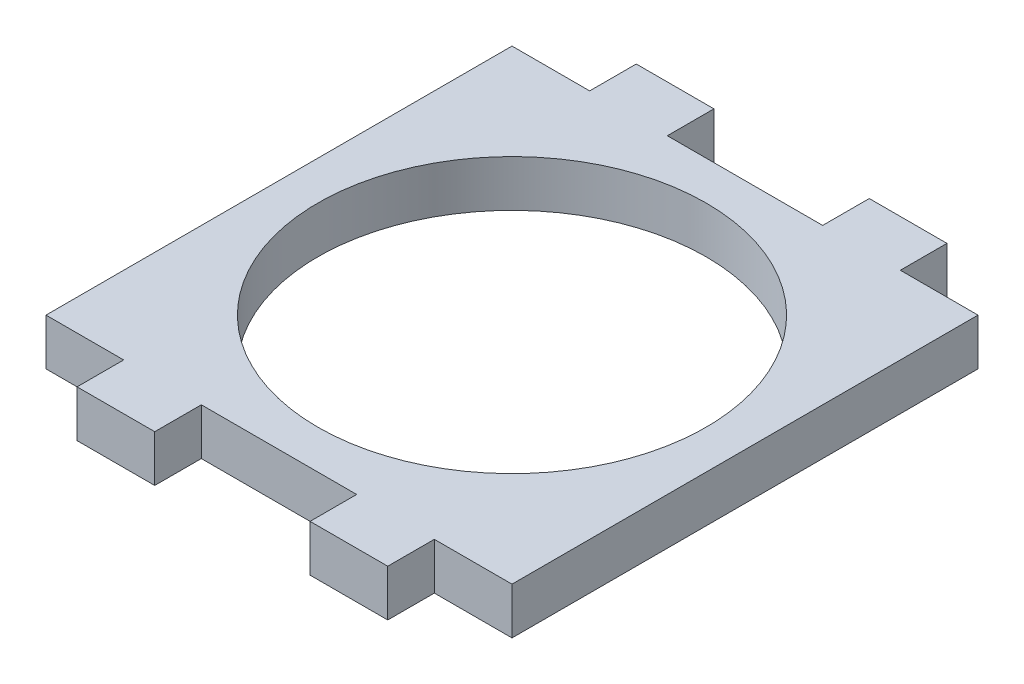
ISO-10303-21;
HEADER;
FILE_DESCRIPTION(('STEP AP214'),'2;1');
FILE_NAME('part.step','',(''),(''),'','','');
FILE_SCHEMA(('AUTOMOTIVE_DESIGN { 1 0 10303 214 1 1 1 1 }'));
ENDSEC;
DATA;
#1=APPLICATION_CONTEXT('core data for automotive mechanical design processes');
#2=APPLICATION_PROTOCOL_DEFINITION('international standard','automotive_design',2000,#1);
#3=PRODUCT_CONTEXT('',#1,'mechanical');
#4=PRODUCT('Part','Part','',(#3));
#5=PRODUCT_RELATED_PRODUCT_CATEGORY('part','',(#4));
#6=PRODUCT_DEFINITION_FORMATION('','',#4);
#7=PRODUCT_DEFINITION_CONTEXT('part definition',#1,'design');
#8=PRODUCT_DEFINITION('design','',#6,#7);
#9=PRODUCT_DEFINITION_SHAPE('','',#8);
#10=(LENGTH_UNIT() NAMED_UNIT(*) SI_UNIT(.MILLI.,.METRE.));
#11=(NAMED_UNIT(*) PLANE_ANGLE_UNIT() SI_UNIT($,.RADIAN.));
#12=(NAMED_UNIT(*) SI_UNIT($,.STERADIAN.) SOLID_ANGLE_UNIT());
#13=UNCERTAINTY_MEASURE_WITH_UNIT(LENGTH_MEASURE(1.E-05),#10,'distance_accuracy_value','');
#14=(GEOMETRIC_REPRESENTATION_CONTEXT(3) GLOBAL_UNCERTAINTY_ASSIGNED_CONTEXT((#13)) GLOBAL_UNIT_ASSIGNED_CONTEXT((#10,
#11,#12)) REPRESENTATION_CONTEXT('',''));
#15=CARTESIAN_POINT('',(0.,0.,0.));
#16=DIRECTION('',(0.,0.,1.));
#17=DIRECTION('',(1.,0.,0.));
#18=AXIS2_PLACEMENT_3D('',#15,#16,#17);
#19=CARTESIAN_POINT('',(30.,6.,0.));
#20=DIRECTION('',(1.,0.,0.));
#21=DIRECTION('',(0.,0.,-1.));
#22=AXIS2_PLACEMENT_3D('',#19,#20,#21);
#23=PLANE('',#22);
#24=DIRECTION('',(0.,0.,1.));
#25=VECTOR('',#24,1.);
#26=CARTESIAN_POINT('',(30.,0.,0.));
#27=LINE('',#26,#25);
#28=CARTESIAN_POINT('',(30.,0.,-30.));
#29=VERTEX_POINT('',#28);
#30=CARTESIAN_POINT('',(30.,0.,30.));
#31=VERTEX_POINT('',#30);
#32=EDGE_CURVE('E207',#29,#31,#27,.T.);
#33=ORIENTED_EDGE('',*,*,#32,.F.);
#34=DIRECTION('',(0.,-1.,0.));
#35=VECTOR('',#34,1.);
#36=CARTESIAN_POINT('',(30.,6.,-30.));
#37=LINE('',#36,#35);
#38=CARTESIAN_POINT('',(30.,6.,-30.));
#39=VERTEX_POINT('',#38);
#40=EDGE_CURVE('E11',#39,#29,#37,.T.);
#41=ORIENTED_EDGE('',*,*,#40,.F.);
#42=DIRECTION('',(0.,0.,1.));
#43=VECTOR('',#42,1.);
#44=CARTESIAN_POINT('',(30.,6.,0.));
#45=LINE('',#44,#43);
#46=CARTESIAN_POINT('',(30.,6.,30.));
#47=VERTEX_POINT('',#46);
#48=EDGE_CURVE('E308',#39,#47,#45,.T.);
#49=ORIENTED_EDGE('',*,*,#48,.T.);
#50=DIRECTION('',(0.,-1.,0.));
#51=VECTOR('',#50,1.);
#52=CARTESIAN_POINT('',(30.,6.,30.));
#53=LINE('',#52,#51);
#54=EDGE_CURVE('E124',#47,#31,#53,.T.);
#55=ORIENTED_EDGE('',*,*,#54,.T.);
#56=EDGE_LOOP('',(#33,#41,#49,#55));
#57=FACE_BOUND('',#56,.T.);
#58=ADVANCED_FACE('F37',(#57),#23,.T.);
#59=CARTESIAN_POINT('',(0.,6.,-30.));
#60=DIRECTION('',(0.,0.,-1.));
#61=DIRECTION('',(-1.,0.,0.));
#62=AXIS2_PLACEMENT_3D('',#59,#60,#61);
#63=PLANE('',#62);
#64=DIRECTION('',(1.,0.,0.));
#65=VECTOR('',#64,1.);
#66=CARTESIAN_POINT('',(0.,0.,-30.));
#67=LINE('',#66,#65);
#68=CARTESIAN_POINT('',(20.0000000000002,0.,-30.));
#69=VERTEX_POINT('',#68);
#70=EDGE_CURVE('E210',#69,#29,#67,.T.);
#71=ORIENTED_EDGE('',*,*,#70,.F.);
#72=DIRECTION('',(0.,-1.,0.));
#73=VECTOR('',#72,1.);
#74=CARTESIAN_POINT('',(20.0000000000002,6.,-30.));
#75=LINE('',#74,#73);
#76=CARTESIAN_POINT('',(20.0000000000002,6.,-30.));
#77=VERTEX_POINT('',#76);
#78=EDGE_CURVE('E46',#77,#69,#75,.T.);
#79=ORIENTED_EDGE('',*,*,#78,.F.);
#80=DIRECTION('',(1.,0.,0.));
#81=VECTOR('',#80,1.);
#82=CARTESIAN_POINT('',(0.,6.,-30.));
#83=LINE('',#82,#81);
#84=EDGE_CURVE('E305',#77,#39,#83,.T.);
#85=ORIENTED_EDGE('',*,*,#84,.T.);
#86=ORIENTED_EDGE('',*,*,#40,.T.);
#87=EDGE_LOOP('',(#71,#79,#85,#86));
#88=FACE_BOUND('',#87,.T.);
#89=ADVANCED_FACE('F304',(#88),#63,.T.);
#90=CARTESIAN_POINT('',(19.9999999999992,6.,6.93889390390704E-13));
#91=DIRECTION('',(-1.,0.,0.));
#92=DIRECTION('',(0.,0.,1.));
#93=AXIS2_PLACEMENT_3D('',#90,#91,#92);
#94=PLANE('',#93);
#95=DIRECTION('',(0.,0.,-1.));
#96=VECTOR('',#95,1.);
#97=CARTESIAN_POINT('',(19.9999999999992,0.,6.93889390390704E-13));
#98=LINE('',#97,#96);
#99=CARTESIAN_POINT('',(20.0000000000004,0.,-35.9999999999998));
#100=VERTEX_POINT('',#99);
#101=EDGE_CURVE('E213',#69,#100,#98,.T.);
#102=ORIENTED_EDGE('',*,*,#101,.T.);
#103=DIRECTION('',(0.,-1.,0.));
#104=VECTOR('',#103,1.);
#105=CARTESIAN_POINT('',(20.0000000000004,6.,-35.9999999999998));
#106=LINE('',#105,#104);
#107=CARTESIAN_POINT('',(20.0000000000004,6.,-35.9999999999998));
#108=VERTEX_POINT('',#107);
#109=EDGE_CURVE('E289',#108,#100,#106,.T.);
#110=ORIENTED_EDGE('',*,*,#109,.F.);
#111=DIRECTION('',(0.,0.,-1.));
#112=VECTOR('',#111,1.);
#113=CARTESIAN_POINT('',(19.9999999999992,6.,6.93889390390704E-13));
#114=LINE('',#113,#112);
#115=EDGE_CURVE('E297',#77,#108,#114,.T.);
#116=ORIENTED_EDGE('',*,*,#115,.F.);
#117=ORIENTED_EDGE('',*,*,#78,.T.);
#118=EDGE_LOOP('',(#102,#110,#116,#117));
#119=FACE_BOUND('',#118,.T.);
#120=ADVANCED_FACE('F294',(#119),#94,.F.);
#121=CARTESIAN_POINT('',(0.,6.,-35.9999999999998));
#122=DIRECTION('',(0.,0.,1.));
#123=DIRECTION('',(1.,0.,0.));
#124=AXIS2_PLACEMENT_3D('',#121,#122,#123);
#125=PLANE('',#124);
#126=DIRECTION('',(-1.,0.,0.));
#127=VECTOR('',#126,1.);
#128=CARTESIAN_POINT('',(0.,0.,-35.9999999999998));
#129=LINE('',#128,#127);
#130=CARTESIAN_POINT('',(10.0000000000004,0.,-35.9999999999998));
#131=VERTEX_POINT('',#130);
#132=EDGE_CURVE('E218',#100,#131,#129,.T.);
#133=ORIENTED_EDGE('',*,*,#132,.T.);
#134=DIRECTION('',(0.,-1.,0.));
#135=VECTOR('',#134,1.);
#136=CARTESIAN_POINT('',(10.0000000000004,6.,-35.9999999999998));
#137=LINE('',#136,#135);
#138=CARTESIAN_POINT('',(10.0000000000004,6.,-35.9999999999998));
#139=VERTEX_POINT('',#138);
#140=EDGE_CURVE('E287',#139,#131,#137,.T.);
#141=ORIENTED_EDGE('',*,*,#140,.F.);
#142=DIRECTION('',(-1.,0.,0.));
#143=VECTOR('',#142,1.);
#144=CARTESIAN_POINT('',(0.,6.,-35.9999999999998));
#145=LINE('',#144,#143);
#146=EDGE_CURVE('E364',#108,#139,#145,.T.);
#147=ORIENTED_EDGE('',*,*,#146,.F.);
#148=ORIENTED_EDGE('',*,*,#109,.T.);
#149=EDGE_LOOP('',(#133,#141,#147,#148));
#150=FACE_BOUND('',#149,.T.);
#151=ADVANCED_FACE('F363',(#150),#125,.F.);
#152=CARTESIAN_POINT('',(9.99999999999917,6.,3.44053489402047E-13));
#153=DIRECTION('',(-1.,0.,0.));
#154=DIRECTION('',(0.,0.,1.));
#155=AXIS2_PLACEMENT_3D('',#152,#153,#154);
#156=PLANE('',#155);
#157=DIRECTION('',(0.,0.,-1.));
#158=VECTOR('',#157,1.);
#159=CARTESIAN_POINT('',(9.99999999999917,0.,3.44053489402047E-13));
#160=LINE('',#159,#158);
#161=CARTESIAN_POINT('',(10.0000000000002,0.,-30.));
#162=VERTEX_POINT('',#161);
#163=EDGE_CURVE('E221',#162,#131,#160,.T.);
#164=ORIENTED_EDGE('',*,*,#163,.F.);
#165=DIRECTION('',(0.,-1.,0.));
#166=VECTOR('',#165,1.);
#167=CARTESIAN_POINT('',(10.0000000000002,6.,-30.));
#168=LINE('',#167,#166);
#169=CARTESIAN_POINT('',(10.0000000000002,6.,-30.));
#170=VERTEX_POINT('',#169);
#171=EDGE_CURVE('E285',#170,#162,#168,.T.);
#172=ORIENTED_EDGE('',*,*,#171,.F.);
#173=DIRECTION('',(0.,0.,-1.));
#174=VECTOR('',#173,1.);
#175=CARTESIAN_POINT('',(9.99999999999917,6.,3.44053489402047E-13));
#176=LINE('',#175,#174);
#177=EDGE_CURVE('E361',#170,#139,#176,.T.);
#178=ORIENTED_EDGE('',*,*,#177,.T.);
#179=ORIENTED_EDGE('',*,*,#140,.T.);
#180=EDGE_LOOP('',(#164,#172,#178,#179));
#181=FACE_BOUND('',#180,.T.);
#182=ADVANCED_FACE('F359',(#181),#156,.T.);
#183=CARTESIAN_POINT('',(-9.99999999999969,0.,-30.));
#184=VERTEX_POINT('',#183);
#185=EDGE_CURVE('E215',#184,#162,#67,.T.);
#186=ORIENTED_EDGE('',*,*,#185,.F.);
#187=DIRECTION('',(0.,-1.,0.));
#188=VECTOR('',#187,1.);
#189=CARTESIAN_POINT('',(-9.99999999999969,6.,-30.));
#190=LINE('',#189,#188);
#191=CARTESIAN_POINT('',(-9.99999999999969,6.,-30.));
#192=VERTEX_POINT('',#191);
#193=EDGE_CURVE('E283',#192,#184,#190,.T.);
#194=ORIENTED_EDGE('',*,*,#193,.F.);
#195=EDGE_CURVE('E355',#192,#170,#83,.T.);
#196=ORIENTED_EDGE('',*,*,#195,.T.);
#197=ORIENTED_EDGE('',*,*,#171,.T.);
#198=EDGE_LOOP('',(#186,#194,#196,#197));
#199=FACE_BOUND('',#198,.T.);
#200=ADVANCED_FACE('F351',(#199),#63,.T.);
#201=CARTESIAN_POINT('',(-10.0000000000007,6.,-3.15141431469159E-13));
#202=DIRECTION('',(-1.,0.,0.));
#203=DIRECTION('',(0.,0.,1.));
#204=AXIS2_PLACEMENT_3D('',#201,#202,#203);
#205=PLANE('',#204);
#206=DIRECTION('',(0.,0.,-1.));
#207=VECTOR('',#206,1.);
#208=CARTESIAN_POINT('',(-10.0000000000007,0.,-3.15141431469159E-13));
#209=LINE('',#208,#207);
#210=CARTESIAN_POINT('',(-9.9999999999996,0.,-35.9999999999998));
#211=VERTEX_POINT('',#210);
#212=EDGE_CURVE('E224',#184,#211,#209,.T.);
#213=ORIENTED_EDGE('',*,*,#212,.T.);
#214=DIRECTION('',(0.,-1.,0.));
#215=VECTOR('',#214,1.);
#216=CARTESIAN_POINT('',(-9.9999999999996,6.,-35.9999999999998));
#217=LINE('',#216,#215);
#218=CARTESIAN_POINT('',(-9.9999999999996,6.,-35.9999999999998));
#219=VERTEX_POINT('',#218);
#220=EDGE_CURVE('E281',#219,#211,#217,.T.);
#221=ORIENTED_EDGE('',*,*,#220,.F.);
#222=DIRECTION('',(0.,0.,-1.));
#223=VECTOR('',#222,1.);
#224=CARTESIAN_POINT('',(-10.0000000000007,6.,-3.15141431469159E-13));
#225=LINE('',#224,#223);
#226=EDGE_CURVE('E372',#192,#219,#225,.T.);
#227=ORIENTED_EDGE('',*,*,#226,.F.);
#228=ORIENTED_EDGE('',*,*,#193,.T.);
#229=EDGE_LOOP('',(#213,#221,#227,#228));
#230=FACE_BOUND('',#229,.T.);
#231=ADVANCED_FACE('F395',(#230),#205,.F.);
#232=CARTESIAN_POINT('',(0.,6.,-35.9999999999998));
#233=DIRECTION('',(0.,0.,-1.));
#234=DIRECTION('',(-1.,0.,0.));
#235=AXIS2_PLACEMENT_3D('',#232,#233,#234);
#236=PLANE('',#235);
#237=DIRECTION('',(1.,0.,0.));
#238=VECTOR('',#237,1.);
#239=CARTESIAN_POINT('',(0.,0.,-35.9999999999998));
#240=LINE('',#239,#238);
#241=CARTESIAN_POINT('',(-19.9999999999996,0.,-35.9999999999998));
#242=VERTEX_POINT('',#241);
#243=EDGE_CURVE('E227',#242,#211,#240,.T.);
#244=ORIENTED_EDGE('',*,*,#243,.F.);
#245=DIRECTION('',(0.,-1.,0.));
#246=VECTOR('',#245,1.);
#247=CARTESIAN_POINT('',(-19.9999999999996,6.,-35.9999999999998));
#248=LINE('',#247,#246);
#249=CARTESIAN_POINT('',(-19.9999999999996,6.,-35.9999999999998));
#250=VERTEX_POINT('',#249);
#251=EDGE_CURVE('E279',#250,#242,#248,.T.);
#252=ORIENTED_EDGE('',*,*,#251,.F.);
#253=DIRECTION('',(1.,0.,0.));
#254=VECTOR('',#253,1.);
#255=CARTESIAN_POINT('',(0.,6.,-35.9999999999998));
#256=LINE('',#255,#254);
#257=EDGE_CURVE('E374',#250,#219,#256,.T.);
#258=ORIENTED_EDGE('',*,*,#257,.T.);
#259=ORIENTED_EDGE('',*,*,#220,.T.);
#260=EDGE_LOOP('',(#244,#252,#258,#259));
#261=FACE_BOUND('',#260,.T.);
#262=ADVANCED_FACE('F392',(#261),#236,.T.);
#263=CARTESIAN_POINT('',(-20.0000000000008,6.,-6.47630097698073E-13));
#264=DIRECTION('',(-1.,0.,0.));
#265=DIRECTION('',(0.,0.,1.));
#266=AXIS2_PLACEMENT_3D('',#263,#264,#265);
#267=PLANE('',#266);
#268=DIRECTION('',(0.,0.,-1.));
#269=VECTOR('',#268,1.);
#270=CARTESIAN_POINT('',(-20.0000000000008,0.,-6.47630097698073E-13));
#271=LINE('',#270,#269);
#272=CARTESIAN_POINT('',(-19.9999999999997,0.,-30.));
#273=VERTEX_POINT('',#272);
#274=EDGE_CURVE('E230',#273,#242,#271,.T.);
#275=ORIENTED_EDGE('',*,*,#274,.F.);
#276=DIRECTION('',(0.,-1.,0.));
#277=VECTOR('',#276,1.);
#278=CARTESIAN_POINT('',(-19.9999999999997,6.,-30.));
#279=LINE('',#278,#277);
#280=CARTESIAN_POINT('',(-19.9999999999997,6.,-30.));
#281=VERTEX_POINT('',#280);
#282=EDGE_CURVE('E277',#281,#273,#279,.T.);
#283=ORIENTED_EDGE('',*,*,#282,.F.);
#284=DIRECTION('',(0.,0.,-1.));
#285=VECTOR('',#284,1.);
#286=CARTESIAN_POINT('',(-20.0000000000008,6.,-6.47630097698073E-13));
#287=LINE('',#286,#285);
#288=EDGE_CURVE('E377',#281,#250,#287,.T.);
#289=ORIENTED_EDGE('',*,*,#288,.T.);
#290=ORIENTED_EDGE('',*,*,#251,.T.);
#291=EDGE_LOOP('',(#275,#283,#289,#290));
#292=FACE_BOUND('',#291,.T.);
#293=ADVANCED_FACE('F389',(#292),#267,.T.);
#294=CARTESIAN_POINT('',(-30.,0.,-30.));
#295=VERTEX_POINT('',#294);
#296=EDGE_CURVE('E214',#295,#273,#67,.T.);
#297=ORIENTED_EDGE('',*,*,#296,.F.);
#298=DIRECTION('',(0.,-1.,0.));
#299=VECTOR('',#298,1.);
#300=CARTESIAN_POINT('',(-30.,6.,-30.));
#301=LINE('',#300,#299);
#302=CARTESIAN_POINT('',(-30.,6.,-30.));
#303=VERTEX_POINT('',#302);
#304=EDGE_CURVE('E275',#303,#295,#301,.T.);
#305=ORIENTED_EDGE('',*,*,#304,.F.);
#306=EDGE_CURVE('E368',#303,#281,#83,.T.);
#307=ORIENTED_EDGE('',*,*,#306,.T.);
#308=ORIENTED_EDGE('',*,*,#282,.T.);
#309=EDGE_LOOP('',(#297,#305,#307,#308));
#310=FACE_BOUND('',#309,.T.);
#311=ADVANCED_FACE('F343',(#310),#63,.T.);
#312=CARTESIAN_POINT('',(-30.,6.,0.));
#313=DIRECTION('',(1.,0.,0.));
#314=DIRECTION('',(0.,0.,-1.));
#315=AXIS2_PLACEMENT_3D('',#312,#313,#314);
#316=PLANE('',#315);
#317=DIRECTION('',(0.,0.,1.));
#318=VECTOR('',#317,1.);
#319=CARTESIAN_POINT('',(-30.,0.,0.));
#320=LINE('',#319,#318);
#321=CARTESIAN_POINT('',(-30.,0.,30.));
#322=VERTEX_POINT('',#321);
#323=EDGE_CURVE('E233',#295,#322,#320,.T.);
#324=ORIENTED_EDGE('',*,*,#323,.T.);
#325=DIRECTION('',(0.,-1.,0.));
#326=VECTOR('',#325,1.);
#327=CARTESIAN_POINT('',(-30.,6.,30.));
#328=LINE('',#327,#326);
#329=CARTESIAN_POINT('',(-30.,6.,30.));
#330=VERTEX_POINT('',#329);
#331=EDGE_CURVE('E272',#330,#322,#328,.T.);
#332=ORIENTED_EDGE('',*,*,#331,.F.);
#333=DIRECTION('',(0.,0.,1.));
#334=VECTOR('',#333,1.);
#335=CARTESIAN_POINT('',(-30.,6.,0.));
#336=LINE('',#335,#334);
#337=EDGE_CURVE('E380',#303,#330,#336,.T.);
#338=ORIENTED_EDGE('',*,*,#337,.F.);
#339=ORIENTED_EDGE('',*,*,#304,.T.);
#340=EDGE_LOOP('',(#324,#332,#338,#339));
#341=FACE_BOUND('',#340,.T.);
#342=ADVANCED_FACE('F339',(#341),#316,.F.);
#343=CARTESIAN_POINT('',(0.,6.,30.));
#344=DIRECTION('',(0.,0.,-1.));
#345=DIRECTION('',(-1.,0.,0.));
#346=AXIS2_PLACEMENT_3D('',#343,#344,#345);
#347=PLANE('',#346);
#348=DIRECTION('',(1.,0.,0.));
#349=VECTOR('',#348,1.);
#350=CARTESIAN_POINT('',(0.,0.,30.));
#351=LINE('',#350,#349);
#352=CARTESIAN_POINT('',(-20.,0.,30.));
#353=VERTEX_POINT('',#352);
#354=EDGE_CURVE('E236',#322,#353,#351,.T.);
#355=ORIENTED_EDGE('',*,*,#354,.T.);
#356=DIRECTION('',(0.,-1.,0.));
#357=VECTOR('',#356,1.);
#358=CARTESIAN_POINT('',(-20.,6.,30.));
#359=LINE('',#358,#357);
#360=CARTESIAN_POINT('',(-20.,6.,30.));
#361=VERTEX_POINT('',#360);
#362=EDGE_CURVE('E269',#361,#353,#359,.T.);
#363=ORIENTED_EDGE('',*,*,#362,.F.);
#364=DIRECTION('',(1.,0.,0.));
#365=VECTOR('',#364,1.);
#366=CARTESIAN_POINT('',(0.,6.,30.));
#367=LINE('',#366,#365);
#368=EDGE_CURVE('E201',#330,#361,#367,.T.);
#369=ORIENTED_EDGE('',*,*,#368,.F.);
#370=ORIENTED_EDGE('',*,*,#331,.T.);
#371=EDGE_LOOP('',(#355,#363,#369,#370));
#372=FACE_BOUND('',#371,.T.);
#373=ADVANCED_FACE('F334',(#372),#347,.F.);
#374=CARTESIAN_POINT('',(-20.,6.,0.));
#375=DIRECTION('',(1.,0.,0.));
#376=DIRECTION('',(0.,0.,-1.));
#377=AXIS2_PLACEMENT_3D('',#374,#375,#376);
#378=PLANE('',#377);
#379=DIRECTION('',(0.,0.,1.));
#380=VECTOR('',#379,1.);
#381=CARTESIAN_POINT('',(-20.,0.,0.));
#382=LINE('',#381,#380);
#383=CARTESIAN_POINT('',(-20.,0.,36.));
#384=VERTEX_POINT('',#383);
#385=EDGE_CURVE('E239',#353,#384,#382,.T.);
#386=ORIENTED_EDGE('',*,*,#385,.T.);
#387=DIRECTION('',(0.,-1.,0.));
#388=VECTOR('',#387,1.);
#389=CARTESIAN_POINT('',(-20.,6.,36.));
#390=LINE('',#389,#388);
#391=CARTESIAN_POINT('',(-20.,6.,36.));
#392=VERTEX_POINT('',#391);
#393=EDGE_CURVE('E266',#392,#384,#390,.T.);
#394=ORIENTED_EDGE('',*,*,#393,.F.);
#395=DIRECTION('',(0.,0.,1.));
#396=VECTOR('',#395,1.);
#397=CARTESIAN_POINT('',(-20.,6.,0.));
#398=LINE('',#397,#396);
#399=EDGE_CURVE('E331',#361,#392,#398,.T.);
#400=ORIENTED_EDGE('',*,*,#399,.F.);
#401=ORIENTED_EDGE('',*,*,#362,.T.);
#402=EDGE_LOOP('',(#386,#394,#400,#401));
#403=FACE_BOUND('',#402,.T.);
#404=ADVANCED_FACE('F329',(#403),#378,.F.);
#405=CARTESIAN_POINT('',(0.,6.,36.));
#406=DIRECTION('',(0.,0.,-1.));
#407=DIRECTION('',(-1.,0.,0.));
#408=AXIS2_PLACEMENT_3D('',#405,#406,#407);
#409=PLANE('',#408);
#410=DIRECTION('',(1.,0.,0.));
#411=VECTOR('',#410,1.);
#412=CARTESIAN_POINT('',(0.,0.,36.));
#413=LINE('',#412,#411);
#414=CARTESIAN_POINT('',(-9.99999999999999,0.,36.));
#415=VERTEX_POINT('',#414);
#416=EDGE_CURVE('E244',#384,#415,#413,.T.);
#417=ORIENTED_EDGE('',*,*,#416,.T.);
#418=DIRECTION('',(0.,-1.,0.));
#419=VECTOR('',#418,1.);
#420=CARTESIAN_POINT('',(-9.99999999999999,6.,36.));
#421=LINE('',#420,#419);
#422=CARTESIAN_POINT('',(-9.99999999999999,6.,36.));
#423=VERTEX_POINT('',#422);
#424=EDGE_CURVE('E264',#423,#415,#421,.T.);
#425=ORIENTED_EDGE('',*,*,#424,.F.);
#426=DIRECTION('',(1.,0.,0.));
#427=VECTOR('',#426,1.);
#428=CARTESIAN_POINT('',(0.,6.,36.));
#429=LINE('',#428,#427);
#430=EDGE_CURVE('E383',#392,#423,#429,.T.);
#431=ORIENTED_EDGE('',*,*,#430,.F.);
#432=ORIENTED_EDGE('',*,*,#393,.T.);
#433=EDGE_LOOP('',(#417,#425,#431,#432));
#434=FACE_BOUND('',#433,.T.);
#435=ADVANCED_FACE('F324',(#434),#409,.F.);
#436=CARTESIAN_POINT('',(-9.99999999999999,6.,0.));
#437=DIRECTION('',(1.,0.,0.));
#438=DIRECTION('',(0.,0.,-1.));
#439=AXIS2_PLACEMENT_3D('',#436,#437,#438);
#440=PLANE('',#439);
#441=DIRECTION('',(0.,0.,1.));
#442=VECTOR('',#441,1.);
#443=CARTESIAN_POINT('',(-9.99999999999999,0.,0.));
#444=LINE('',#443,#442);
#445=CARTESIAN_POINT('',(-9.99999999999999,0.,30.));
#446=VERTEX_POINT('',#445);
#447=EDGE_CURVE('E247',#446,#415,#444,.T.);
#448=ORIENTED_EDGE('',*,*,#447,.F.);
#449=DIRECTION('',(0.,-1.,0.));
#450=VECTOR('',#449,1.);
#451=CARTESIAN_POINT('',(-9.99999999999999,6.,30.));
#452=LINE('',#451,#450);
#453=CARTESIAN_POINT('',(-9.99999999999999,6.,30.));
#454=VERTEX_POINT('',#453);
#455=EDGE_CURVE('E262',#454,#446,#452,.T.);
#456=ORIENTED_EDGE('',*,*,#455,.F.);
#457=DIRECTION('',(0.,0.,1.));
#458=VECTOR('',#457,1.);
#459=CARTESIAN_POINT('',(-9.99999999999999,6.,0.));
#460=LINE('',#459,#458);
#461=EDGE_CURVE('E322',#454,#423,#460,.T.);
#462=ORIENTED_EDGE('',*,*,#461,.T.);
#463=ORIENTED_EDGE('',*,*,#424,.T.);
#464=EDGE_LOOP('',(#448,#456,#462,#463));
#465=FACE_BOUND('',#464,.T.);
#466=ADVANCED_FACE('F318',(#465),#440,.T.);
#467=CARTESIAN_POINT('',(10.,0.,30.));
#468=VERTEX_POINT('',#467);
#469=EDGE_CURVE('E241',#446,#468,#351,.T.);
#470=ORIENTED_EDGE('',*,*,#469,.T.);
#471=DIRECTION('',(0.,-1.,0.));
#472=VECTOR('',#471,1.);
#473=CARTESIAN_POINT('',(10.,6.,30.));
#474=LINE('',#473,#472);
#475=CARTESIAN_POINT('',(10.,6.,30.));
#476=VERTEX_POINT('',#475);
#477=EDGE_CURVE('E259',#476,#468,#474,.T.);
#478=ORIENTED_EDGE('',*,*,#477,.F.);
#479=EDGE_CURVE('E200',#454,#476,#367,.T.);
#480=ORIENTED_EDGE('',*,*,#479,.F.);
#481=ORIENTED_EDGE('',*,*,#455,.T.);
#482=EDGE_LOOP('',(#470,#478,#480,#481));
#483=FACE_BOUND('',#482,.T.);
#484=ADVANCED_FACE('F314',(#483),#347,.F.);
#485=CARTESIAN_POINT('',(9.99999999999991,6.,0.));
#486=DIRECTION('',(1.,0.,0.));
#487=DIRECTION('',(0.,0.,-1.));
#488=AXIS2_PLACEMENT_3D('',#485,#486,#487);
#489=PLANE('',#488);
#490=DIRECTION('',(0.,0.,1.));
#491=VECTOR('',#490,1.);
#492=CARTESIAN_POINT('',(9.99999999999991,0.,0.));
#493=LINE('',#492,#491);
#494=CARTESIAN_POINT('',(10.,0.,36.));
#495=VERTEX_POINT('',#494);
#496=EDGE_CURVE('E250',#468,#495,#493,.T.);
#497=ORIENTED_EDGE('',*,*,#496,.T.);
#498=DIRECTION('',(0.,-1.,0.));
#499=VECTOR('',#498,1.);
#500=CARTESIAN_POINT('',(10.,6.,36.));
#501=LINE('',#500,#499);
#502=CARTESIAN_POINT('',(10.,6.,36.));
#503=VERTEX_POINT('',#502);
#504=EDGE_CURVE('E189',#503,#495,#501,.T.);
#505=ORIENTED_EDGE('',*,*,#504,.F.);
#506=DIRECTION('',(0.,0.,1.));
#507=VECTOR('',#506,1.);
#508=CARTESIAN_POINT('',(9.99999999999991,6.,0.));
#509=LINE('',#508,#507);
#510=EDGE_CURVE('E194',#476,#503,#509,.T.);
#511=ORIENTED_EDGE('',*,*,#510,.F.);
#512=ORIENTED_EDGE('',*,*,#477,.T.);
#513=EDGE_LOOP('',(#497,#505,#511,#512));
#514=FACE_BOUND('',#513,.T.);
#515=ADVANCED_FACE('F503',(#514),#489,.F.);
#516=CARTESIAN_POINT('',(0.,6.,36.));
#517=DIRECTION('',(0.,0.,1.));
#518=DIRECTION('',(1.,0.,0.));
#519=AXIS2_PLACEMENT_3D('',#516,#517,#518);
#520=PLANE('',#519);
#521=DIRECTION('',(-1.,0.,0.));
#522=VECTOR('',#521,1.);
#523=CARTESIAN_POINT('',(0.,0.,36.));
#524=LINE('',#523,#522);
#525=CARTESIAN_POINT('',(20.,0.,36.));
#526=VERTEX_POINT('',#525);
#527=EDGE_CURVE('E184',#526,#495,#524,.T.);
#528=ORIENTED_EDGE('',*,*,#527,.F.);
#529=DIRECTION('',(0.,-1.,0.));
#530=VECTOR('',#529,1.);
#531=CARTESIAN_POINT('',(20.,6.,36.));
#532=LINE('',#531,#530);
#533=CARTESIAN_POINT('',(20.,6.,36.));
#534=VERTEX_POINT('',#533);
#535=EDGE_CURVE('E179',#534,#526,#532,.T.);
#536=ORIENTED_EDGE('',*,*,#535,.F.);
#537=DIRECTION('',(-1.,0.,0.));
#538=VECTOR('',#537,1.);
#539=CARTESIAN_POINT('',(0.,6.,36.));
#540=LINE('',#539,#538);
#541=EDGE_CURVE('E182',#534,#503,#540,.T.);
#542=ORIENTED_EDGE('',*,*,#541,.T.);
#543=ORIENTED_EDGE('',*,*,#504,.T.);
#544=EDGE_LOOP('',(#528,#536,#542,#543));
#545=FACE_BOUND('',#544,.T.);
#546=ADVANCED_FACE('F181',(#545),#520,.T.);
#547=CARTESIAN_POINT('',(19.9999999999999,6.,0.));
#548=DIRECTION('',(1.,0.,0.));
#549=DIRECTION('',(0.,0.,-1.));
#550=AXIS2_PLACEMENT_3D('',#547,#548,#549);
#551=PLANE('',#550);
#552=DIRECTION('',(0.,0.,1.));
#553=VECTOR('',#552,1.);
#554=CARTESIAN_POINT('',(19.9999999999999,0.,0.));
#555=LINE('',#554,#553);
#556=CARTESIAN_POINT('',(20.,0.,30.));
#557=VERTEX_POINT('',#556);
#558=EDGE_CURVE('E254',#557,#526,#555,.T.);
#559=ORIENTED_EDGE('',*,*,#558,.F.);
#560=DIRECTION('',(0.,-1.,0.));
#561=VECTOR('',#560,1.);
#562=CARTESIAN_POINT('',(20.,6.,30.));
#563=LINE('',#562,#561);
#564=CARTESIAN_POINT('',(20.,6.,30.));
#565=VERTEX_POINT('',#564);
#566=EDGE_CURVE('E117',#565,#557,#563,.T.);
#567=ORIENTED_EDGE('',*,*,#566,.F.);
#568=DIRECTION('',(0.,0.,1.));
#569=VECTOR('',#568,1.);
#570=CARTESIAN_POINT('',(19.9999999999999,6.,0.));
#571=LINE('',#570,#569);
#572=EDGE_CURVE('E192',#565,#534,#571,.T.);
#573=ORIENTED_EDGE('',*,*,#572,.T.);
#574=ORIENTED_EDGE('',*,*,#535,.T.);
#575=EDGE_LOOP('',(#559,#567,#573,#574));
#576=FACE_BOUND('',#575,.T.);
#577=ADVANCED_FACE('F197',(#576),#551,.T.);
#578=CARTESIAN_POINT('',(0.,6.,0.));
#579=DIRECTION('',(0.,-1.,0.));
#580=DIRECTION('',(0.,0.,-1.));
#581=AXIS2_PLACEMENT_3D('',#578,#579,#580);
#582=CYLINDRICAL_SURFACE('',#581,25.);
#583=CARTESIAN_POINT('',(0.,6.,0.));
#584=DIRECTION('',(0.,1.,0.));
#585=DIRECTION('',(0.,0.,1.));
#586=AXIS2_PLACEMENT_3D('',#583,#584,#585);
#587=CIRCLE('',#586,25.);
#588=CARTESIAN_POINT('',(0.,6.,25.));
#589=VERTEX_POINT('',#588);
#590=EDGE_CURVE('E306',#589,#589,#587,.T.);
#591=ORIENTED_EDGE('',*,*,#590,.T.);
#592=EDGE_LOOP('',(#591));
#593=FACE_BOUND('',#592,.T.);
#594=CARTESIAN_POINT('',(0.,0.,0.));
#595=DIRECTION('',(0.,1.,0.));
#596=DIRECTION('',(0.,0.,1.));
#597=AXIS2_PLACEMENT_3D('',#594,#595,#596);
#598=CIRCLE('',#597,25.);
#599=CARTESIAN_POINT('',(0.,0.,25.));
#600=VERTEX_POINT('',#599);
#601=EDGE_CURVE('E204',#600,#600,#598,.T.);
#602=ORIENTED_EDGE('',*,*,#601,.F.);
#603=EDGE_LOOP('',(#602));
#604=FACE_BOUND('',#603,.T.);
#605=ADVANCED_FACE('F39',(#593,#604),#582,.F.);
#606=EDGE_CURVE('E240',#557,#31,#351,.T.);
#607=ORIENTED_EDGE('',*,*,#606,.T.);
#608=ORIENTED_EDGE('',*,*,#54,.F.);
#609=EDGE_CURVE('E54',#565,#47,#367,.T.);
#610=ORIENTED_EDGE('',*,*,#609,.F.);
#611=ORIENTED_EDGE('',*,*,#566,.T.);
#612=EDGE_LOOP('',(#607,#608,#610,#611));
#613=FACE_BOUND('',#612,.T.);
#614=ADVANCED_FACE('F469',(#613),#347,.F.);
#615=CARTESIAN_POINT('',(0.,6.,0.));
#616=DIRECTION('',(0.,1.,0.));
#617=DIRECTION('',(0.,0.,1.));
#618=AXIS2_PLACEMENT_3D('',#615,#616,#617);
#619=PLANE('',#618);
#620=ORIENTED_EDGE('',*,*,#590,.F.);
#621=EDGE_LOOP('',(#620));
#622=FACE_BOUND('',#621,.T.);
#623=ORIENTED_EDGE('',*,*,#48,.F.);
#624=ORIENTED_EDGE('',*,*,#84,.F.);
#625=ORIENTED_EDGE('',*,*,#115,.T.);
#626=ORIENTED_EDGE('',*,*,#146,.T.);
#627=ORIENTED_EDGE('',*,*,#177,.F.);
#628=ORIENTED_EDGE('',*,*,#195,.F.);
#629=ORIENTED_EDGE('',*,*,#226,.T.);
#630=ORIENTED_EDGE('',*,*,#257,.F.);
#631=ORIENTED_EDGE('',*,*,#288,.F.);
#632=ORIENTED_EDGE('',*,*,#306,.F.);
#633=ORIENTED_EDGE('',*,*,#337,.T.);
#634=ORIENTED_EDGE('',*,*,#368,.T.);
#635=ORIENTED_EDGE('',*,*,#399,.T.);
#636=ORIENTED_EDGE('',*,*,#430,.T.);
#637=ORIENTED_EDGE('',*,*,#461,.F.);
#638=ORIENTED_EDGE('',*,*,#479,.T.);
#639=ORIENTED_EDGE('',*,*,#510,.T.);
#640=ORIENTED_EDGE('',*,*,#541,.F.);
#641=ORIENTED_EDGE('',*,*,#572,.F.);
#642=ORIENTED_EDGE('',*,*,#609,.T.);
#643=EDGE_LOOP('',(#623,#624,#625,#626,#627,#628,#629,#630,#631,#632,#633,#634,#635,#636,#637,
#638,#639,#640,#641,#642));
#644=FACE_BOUND('',#643,.T.);
#645=ADVANCED_FACE('F191',(#622,#644),#619,.T.);
#646=CARTESIAN_POINT('',(0.,0.,0.));
#647=DIRECTION('',(0.,1.,0.));
#648=DIRECTION('',(0.,0.,1.));
#649=AXIS2_PLACEMENT_3D('',#646,#647,#648);
#650=PLANE('',#649);
#651=ORIENTED_EDGE('',*,*,#601,.T.);
#652=EDGE_LOOP('',(#651));
#653=FACE_BOUND('',#652,.T.);
#654=ORIENTED_EDGE('',*,*,#32,.T.);
#655=ORIENTED_EDGE('',*,*,#606,.F.);
#656=ORIENTED_EDGE('',*,*,#558,.T.);
#657=ORIENTED_EDGE('',*,*,#527,.T.);
#658=ORIENTED_EDGE('',*,*,#496,.F.);
#659=ORIENTED_EDGE('',*,*,#469,.F.);
#660=ORIENTED_EDGE('',*,*,#447,.T.);
#661=ORIENTED_EDGE('',*,*,#416,.F.);
#662=ORIENTED_EDGE('',*,*,#385,.F.);
#663=ORIENTED_EDGE('',*,*,#354,.F.);
#664=ORIENTED_EDGE('',*,*,#323,.F.);
#665=ORIENTED_EDGE('',*,*,#296,.T.);
#666=ORIENTED_EDGE('',*,*,#274,.T.);
#667=ORIENTED_EDGE('',*,*,#243,.T.);
#668=ORIENTED_EDGE('',*,*,#212,.F.);
#669=ORIENTED_EDGE('',*,*,#185,.T.);
#670=ORIENTED_EDGE('',*,*,#163,.T.);
#671=ORIENTED_EDGE('',*,*,#132,.F.);
#672=ORIENTED_EDGE('',*,*,#101,.F.);
#673=ORIENTED_EDGE('',*,*,#70,.T.);
#674=EDGE_LOOP('',(#654,#655,#656,#657,#658,#659,#660,#661,#662,#663,#664,#665,#666,#667,#668,
#669,#670,#671,#672,#673));
#675=FACE_BOUND('',#674,.T.);
#676=ADVANCED_FACE('F303',(#653,#675),#650,.F.);
#677=CLOSED_SHELL('',(#58,#89,#120,#151,#182,#200,#231,#262,#293,#311,#342,#373,#404,#435,#466,
#484,#515,#546,#577,#605,#614,#645,#676));
#678=MANIFOLD_SOLID_BREP('B2',#677);
#679=ADVANCED_BREP_SHAPE_REPRESENTATION('',(#18,#678),#14);
#680=SHAPE_DEFINITION_REPRESENTATION(#9,#679);
ENDSEC;
END-ISO-10303-21;
